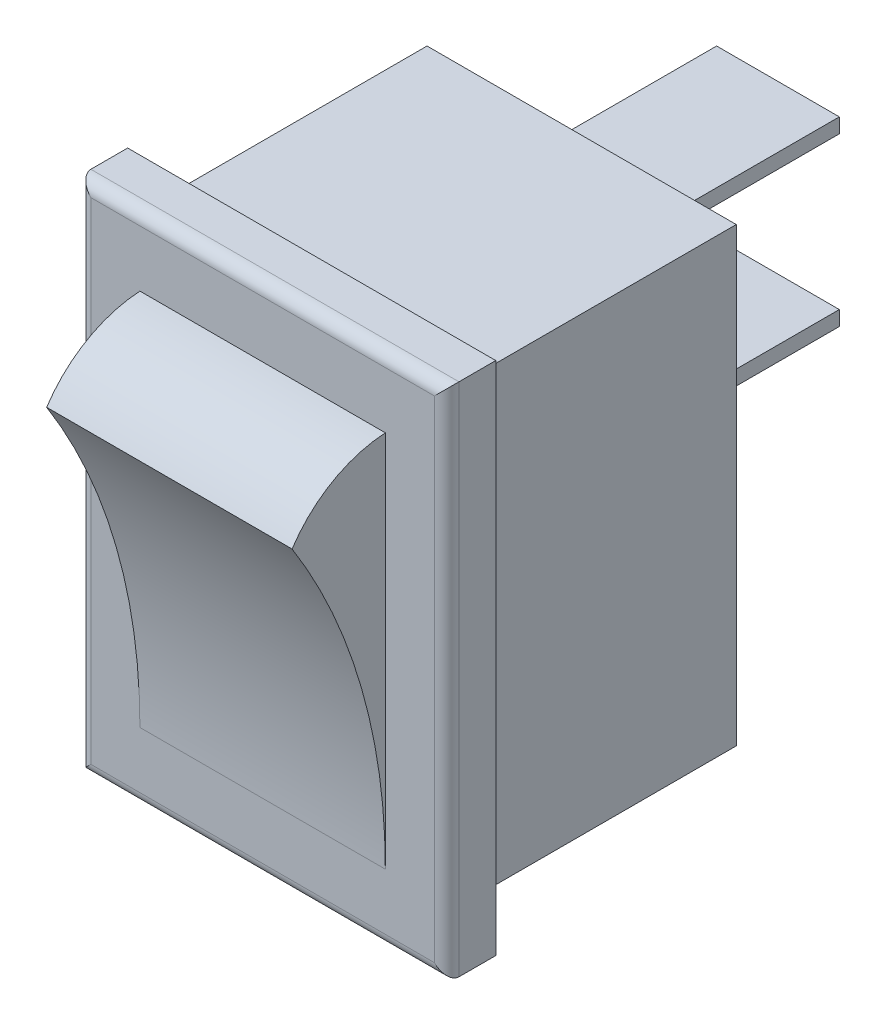
ISO-10303-21;
HEADER;
FILE_DESCRIPTION(('STEP AP214'),'2;1');
FILE_NAME('part.step','',(''),(''),'','','');
FILE_SCHEMA(('AUTOMOTIVE_DESIGN { 1 0 10303 214 1 1 1 1 }'));
ENDSEC;
DATA;
#1=APPLICATION_CONTEXT('core data for automotive mechanical design processes');
#2=APPLICATION_PROTOCOL_DEFINITION('international standard','automotive_design',2000,#1);
#3=PRODUCT_CONTEXT('',#1,'mechanical');
#4=PRODUCT('Part','Part','',(#3));
#5=PRODUCT_RELATED_PRODUCT_CATEGORY('part','',(#4));
#6=PRODUCT_DEFINITION_FORMATION('','',#4);
#7=PRODUCT_DEFINITION_CONTEXT('part definition',#1,'design');
#8=PRODUCT_DEFINITION('design','',#6,#7);
#9=PRODUCT_DEFINITION_SHAPE('','',#8);
#10=(LENGTH_UNIT() NAMED_UNIT(*) SI_UNIT(.MILLI.,.METRE.));
#11=(NAMED_UNIT(*) PLANE_ANGLE_UNIT() SI_UNIT($,.RADIAN.));
#12=(NAMED_UNIT(*) SI_UNIT($,.STERADIAN.) SOLID_ANGLE_UNIT());
#13=UNCERTAINTY_MEASURE_WITH_UNIT(LENGTH_MEASURE(1.E-05),#10,'distance_accuracy_value','');
#14=(GEOMETRIC_REPRESENTATION_CONTEXT(3) GLOBAL_UNCERTAINTY_ASSIGNED_CONTEXT((#13)) GLOBAL_UNIT_ASSIGNED_CONTEXT((#10,
#11,#12)) REPRESENTATION_CONTEXT('',''));
#15=CARTESIAN_POINT('',(0.,0.,0.));
#16=DIRECTION('',(0.,0.,1.));
#17=DIRECTION('',(1.,0.,0.));
#18=AXIS2_PLACEMENT_3D('',#15,#16,#17);
#19=CARTESIAN_POINT('',(0.,0.,0.));
#20=DIRECTION('',(0.,0.,-1.));
#21=DIRECTION('',(-1.,0.,0.));
#22=AXIS2_PLACEMENT_3D('',#19,#20,#21);
#23=PLANE('',#22);
#24=DIRECTION('',(0.,1.,0.));
#25=VECTOR('',#24,1.);
#26=CARTESIAN_POINT('',(6.3,-9.2,0.));
#27=LINE('',#26,#25);
#28=CARTESIAN_POINT('',(6.3,-9.2,0.));
#29=VERTEX_POINT('',#28);
#30=CARTESIAN_POINT('',(6.3,9.2,0.));
#31=VERTEX_POINT('',#30);
#32=EDGE_CURVE('E318',#29,#31,#27,.T.);
#33=ORIENTED_EDGE('',*,*,#32,.F.);
#34=DIRECTION('',(1.,0.,0.));
#35=VECTOR('',#34,1.);
#36=CARTESIAN_POINT('',(-6.3,-9.2,0.));
#37=LINE('',#36,#35);
#38=CARTESIAN_POINT('',(-6.3,-9.2,0.));
#39=VERTEX_POINT('',#38);
#40=EDGE_CURVE('E324',#39,#29,#37,.T.);
#41=ORIENTED_EDGE('',*,*,#40,.F.);
#42=DIRECTION('',(0.,-1.,0.));
#43=VECTOR('',#42,1.);
#44=CARTESIAN_POINT('',(-6.3,-9.2,0.));
#45=LINE('',#44,#43);
#46=CARTESIAN_POINT('',(-6.3,9.2,0.));
#47=VERTEX_POINT('',#46);
#48=EDGE_CURVE('E343',#47,#39,#45,.T.);
#49=ORIENTED_EDGE('',*,*,#48,.F.);
#50=DIRECTION('',(-1.,0.,0.));
#51=VECTOR('',#50,1.);
#52=CARTESIAN_POINT('',(-6.3,9.2,0.));
#53=LINE('',#52,#51);
#54=EDGE_CURVE('E340',#31,#47,#53,.T.);
#55=ORIENTED_EDGE('',*,*,#54,.F.);
#56=EDGE_LOOP('',(#33,#41,#49,#55));
#57=FACE_BOUND('',#56,.T.);
#58=DIRECTION('',(-1.,0.,0.));
#59=VECTOR('',#58,1.);
#60=CARTESIAN_POINT('',(-2.5,-0.3,0.));
#61=LINE('',#60,#59);
#62=CARTESIAN_POINT('',(2.5,-0.3,0.));
#63=VERTEX_POINT('',#62);
#64=CARTESIAN_POINT('',(-2.5,-0.3,0.));
#65=VERTEX_POINT('',#64);
#66=EDGE_CURVE('E218',#63,#65,#61,.T.);
#67=ORIENTED_EDGE('',*,*,#66,.F.);
#68=DIRECTION('',(0.,-1.,0.));
#69=VECTOR('',#68,1.);
#70=CARTESIAN_POINT('',(2.5,-0.3,0.));
#71=LINE('',#70,#69);
#72=CARTESIAN_POINT('',(2.5,0.3,0.));
#73=VERTEX_POINT('',#72);
#74=EDGE_CURVE('E213',#73,#63,#71,.T.);
#75=ORIENTED_EDGE('',*,*,#74,.F.);
#76=DIRECTION('',(1.,0.,0.));
#77=VECTOR('',#76,1.);
#78=CARTESIAN_POINT('',(-2.5,0.3,0.));
#79=LINE('',#78,#77);
#80=CARTESIAN_POINT('',(-2.5,0.3,0.));
#81=VERTEX_POINT('',#80);
#82=EDGE_CURVE('E228',#81,#73,#79,.T.);
#83=ORIENTED_EDGE('',*,*,#82,.F.);
#84=DIRECTION('',(0.,1.,0.));
#85=VECTOR('',#84,1.);
#86=CARTESIAN_POINT('',(-2.5,-0.3,0.));
#87=LINE('',#86,#85);
#88=EDGE_CURVE('E240',#65,#81,#87,.T.);
#89=ORIENTED_EDGE('',*,*,#88,.F.);
#90=EDGE_LOOP('',(#67,#75,#83,#89));
#91=FACE_BOUND('',#90,.T.);
#92=DIRECTION('',(-1.,0.,0.));
#93=VECTOR('',#92,1.);
#94=CARTESIAN_POINT('',(-2.5,6.5,0.));
#95=LINE('',#94,#93);
#96=CARTESIAN_POINT('',(2.5,6.5,0.));
#97=VERTEX_POINT('',#96);
#98=CARTESIAN_POINT('',(-2.5,6.5,0.));
#99=VERTEX_POINT('',#98);
#100=EDGE_CURVE('E671',#97,#99,#95,.T.);
#101=ORIENTED_EDGE('',*,*,#100,.F.);
#102=DIRECTION('',(0.,-1.,0.));
#103=VECTOR('',#102,1.);
#104=CARTESIAN_POINT('',(2.5,6.5,0.));
#105=LINE('',#104,#103);
#106=CARTESIAN_POINT('',(2.5,7.1,0.));
#107=VERTEX_POINT('',#106);
#108=EDGE_CURVE('E210',#107,#97,#105,.T.);
#109=ORIENTED_EDGE('',*,*,#108,.F.);
#110=DIRECTION('',(1.,0.,0.));
#111=VECTOR('',#110,1.);
#112=CARTESIAN_POINT('',(-2.5,7.1,0.));
#113=LINE('',#112,#111);
#114=CARTESIAN_POINT('',(-2.5,7.1,0.));
#115=VERTEX_POINT('',#114);
#116=EDGE_CURVE('E206',#115,#107,#113,.T.);
#117=ORIENTED_EDGE('',*,*,#116,.F.);
#118=DIRECTION('',(0.,1.,0.));
#119=VECTOR('',#118,1.);
#120=CARTESIAN_POINT('',(-2.5,6.5,0.));
#121=LINE('',#120,#119);
#122=EDGE_CURVE('E667',#99,#115,#121,.T.);
#123=ORIENTED_EDGE('',*,*,#122,.F.);
#124=EDGE_LOOP('',(#101,#109,#117,#123));
#125=FACE_BOUND('',#124,.T.);
#126=ADVANCED_FACE('F39',(#57,#91,#125),#23,.T.);
#127=CARTESIAN_POINT('',(6.3,-9.2,11.));
#128=DIRECTION('',(-1.,0.,0.));
#129=DIRECTION('',(0.,0.,1.));
#130=AXIS2_PLACEMENT_3D('',#127,#128,#129);
#131=PLANE('',#130);
#132=ORIENTED_EDGE('',*,*,#32,.T.);
#133=DIRECTION('',(0.,0.,-1.));
#134=VECTOR('',#133,1.);
#135=CARTESIAN_POINT('',(6.3,9.2,11.));
#136=LINE('',#135,#134);
#137=CARTESIAN_POINT('',(6.3,9.2,11.));
#138=VERTEX_POINT('',#137);
#139=EDGE_CURVE('E359',#138,#31,#136,.T.);
#140=ORIENTED_EDGE('',*,*,#139,.F.);
#141=DIRECTION('',(0.,1.,0.));
#142=VECTOR('',#141,1.);
#143=CARTESIAN_POINT('',(6.3,-9.2,11.));
#144=LINE('',#143,#142);
#145=CARTESIAN_POINT('',(6.3,-9.2,11.));
#146=VERTEX_POINT('',#145);
#147=EDGE_CURVE('E319',#146,#138,#144,.T.);
#148=ORIENTED_EDGE('',*,*,#147,.F.);
#149=DIRECTION('',(0.,0.,-1.));
#150=VECTOR('',#149,1.);
#151=CARTESIAN_POINT('',(6.3,-9.2,11.));
#152=LINE('',#151,#150);
#153=EDGE_CURVE('E336',#146,#29,#152,.T.);
#154=ORIENTED_EDGE('',*,*,#153,.T.);
#155=EDGE_LOOP('',(#132,#140,#148,#154));
#156=FACE_BOUND('',#155,.T.);
#157=ADVANCED_FACE('F445',(#156),#131,.F.);
#158=CARTESIAN_POINT('',(-6.3,9.2,11.));
#159=DIRECTION('',(0.,-1.,0.));
#160=DIRECTION('',(0.,0.,-1.));
#161=AXIS2_PLACEMENT_3D('',#158,#159,#160);
#162=PLANE('',#161);
#163=ORIENTED_EDGE('',*,*,#54,.T.);
#164=DIRECTION('',(0.,0.,-1.));
#165=VECTOR('',#164,1.);
#166=CARTESIAN_POINT('',(-6.3,9.2,11.));
#167=LINE('',#166,#165);
#168=CARTESIAN_POINT('',(-6.3,9.2,11.));
#169=VERTEX_POINT('',#168);
#170=EDGE_CURVE('E355',#169,#47,#167,.T.);
#171=ORIENTED_EDGE('',*,*,#170,.F.);
#172=DIRECTION('',(-1.,0.,0.));
#173=VECTOR('',#172,1.);
#174=CARTESIAN_POINT('',(-6.3,9.2,11.));
#175=LINE('',#174,#173);
#176=EDGE_CURVE('E323',#138,#169,#175,.T.);
#177=ORIENTED_EDGE('',*,*,#176,.F.);
#178=ORIENTED_EDGE('',*,*,#139,.T.);
#179=EDGE_LOOP('',(#163,#171,#177,#178));
#180=FACE_BOUND('',#179,.T.);
#181=ADVANCED_FACE('F451',(#180),#162,.F.);
#182=CARTESIAN_POINT('',(-6.3,-9.2,11.));
#183=DIRECTION('',(1.,0.,0.));
#184=DIRECTION('',(0.,0.,-1.));
#185=AXIS2_PLACEMENT_3D('',#182,#183,#184);
#186=PLANE('',#185);
#187=ORIENTED_EDGE('',*,*,#48,.T.);
#188=DIRECTION('',(0.,0.,-1.));
#189=VECTOR('',#188,1.);
#190=CARTESIAN_POINT('',(-6.3,-9.2,11.));
#191=LINE('',#190,#189);
#192=CARTESIAN_POINT('',(-6.3,-9.2,11.));
#193=VERTEX_POINT('',#192);
#194=EDGE_CURVE('E351',#193,#39,#191,.T.);
#195=ORIENTED_EDGE('',*,*,#194,.F.);
#196=DIRECTION('',(0.,-1.,0.));
#197=VECTOR('',#196,1.);
#198=CARTESIAN_POINT('',(-6.3,-9.2,11.));
#199=LINE('',#198,#197);
#200=EDGE_CURVE('E328',#169,#193,#199,.T.);
#201=ORIENTED_EDGE('',*,*,#200,.F.);
#202=ORIENTED_EDGE('',*,*,#170,.T.);
#203=EDGE_LOOP('',(#187,#195,#201,#202));
#204=FACE_BOUND('',#203,.T.);
#205=ADVANCED_FACE('F462',(#204),#186,.F.);
#206=CARTESIAN_POINT('',(-6.3,-9.2,11.));
#207=DIRECTION('',(0.,1.,0.));
#208=DIRECTION('',(0.,0.,1.));
#209=AXIS2_PLACEMENT_3D('',#206,#207,#208);
#210=PLANE('',#209);
#211=ORIENTED_EDGE('',*,*,#40,.T.);
#212=ORIENTED_EDGE('',*,*,#153,.F.);
#213=DIRECTION('',(1.,0.,0.));
#214=VECTOR('',#213,1.);
#215=CARTESIAN_POINT('',(-6.3,-9.2,11.));
#216=LINE('',#215,#214);
#217=EDGE_CURVE('E332',#193,#146,#216,.T.);
#218=ORIENTED_EDGE('',*,*,#217,.F.);
#219=ORIENTED_EDGE('',*,*,#194,.T.);
#220=EDGE_LOOP('',(#211,#212,#218,#219));
#221=FACE_BOUND('',#220,.T.);
#222=ADVANCED_FACE('F459',(#221),#210,.F.);
#223=CARTESIAN_POINT('',(7.5,-10.5,13.));
#224=DIRECTION('',(-1.,0.,0.));
#225=DIRECTION('',(0.,0.,1.));
#226=AXIS2_PLACEMENT_3D('',#223,#224,#225);
#227=PLANE('',#226);
#228=DIRECTION('',(0.,0.,-1.));
#229=VECTOR('',#228,1.);
#230=CARTESIAN_POINT('',(7.5,10.5,13.));
#231=LINE('',#230,#229);
#232=CARTESIAN_POINT('',(7.5,10.5,12.5));
#233=VERTEX_POINT('',#232);
#234=CARTESIAN_POINT('',(7.5,10.5,11.));
#235=VERTEX_POINT('',#234);
#236=EDGE_CURVE('E315',#233,#235,#231,.T.);
#237=ORIENTED_EDGE('',*,*,#236,.F.);
#238=DIRECTION('',(0.,1.,0.));
#239=VECTOR('',#238,1.);
#240=CARTESIAN_POINT('',(7.5,-10.5,12.5));
#241=LINE('',#240,#239);
#242=CARTESIAN_POINT('',(7.5,-10.5,12.5));
#243=VERTEX_POINT('',#242);
#244=EDGE_CURVE('E11',#233,#243,#241,.F.);
#245=ORIENTED_EDGE('',*,*,#244,.T.);
#246=DIRECTION('',(0.,0.,-1.));
#247=VECTOR('',#246,1.);
#248=CARTESIAN_POINT('',(7.5,-10.5,13.));
#249=LINE('',#248,#247);
#250=CARTESIAN_POINT('',(7.5,-10.5,11.));
#251=VERTEX_POINT('',#250);
#252=EDGE_CURVE('E306',#243,#251,#249,.T.);
#253=ORIENTED_EDGE('',*,*,#252,.T.);
#254=DIRECTION('',(0.,1.,0.));
#255=VECTOR('',#254,1.);
#256=CARTESIAN_POINT('',(7.5,-10.5,11.));
#257=LINE('',#256,#255);
#258=EDGE_CURVE('E290',#251,#235,#257,.T.);
#259=ORIENTED_EDGE('',*,*,#258,.T.);
#260=EDGE_LOOP('',(#237,#245,#253,#259));
#261=FACE_BOUND('',#260,.T.);
#262=ADVANCED_FACE('F413',(#261),#227,.F.);
#263=CARTESIAN_POINT('',(-7.5,10.5,13.));
#264=DIRECTION('',(0.,-1.,0.));
#265=DIRECTION('',(0.,0.,-1.));
#266=AXIS2_PLACEMENT_3D('',#263,#264,#265);
#267=PLANE('',#266);
#268=DIRECTION('',(0.,0.,-1.));
#269=VECTOR('',#268,1.);
#270=CARTESIAN_POINT('',(-7.5,10.5,13.));
#271=LINE('',#270,#269);
#272=CARTESIAN_POINT('',(-7.5,10.5,12.5));
#273=VERTEX_POINT('',#272);
#274=CARTESIAN_POINT('',(-7.5,10.5,11.));
#275=VERTEX_POINT('',#274);
#276=EDGE_CURVE('E312',#273,#275,#271,.T.);
#277=ORIENTED_EDGE('',*,*,#276,.F.);
#278=DIRECTION('',(-1.,0.,0.));
#279=VECTOR('',#278,1.);
#280=CARTESIAN_POINT('',(-7.5,10.5,12.5));
#281=LINE('',#280,#279);
#282=EDGE_CURVE('E49',#273,#233,#281,.F.);
#283=ORIENTED_EDGE('',*,*,#282,.T.);
#284=ORIENTED_EDGE('',*,*,#236,.T.);
#285=DIRECTION('',(-1.,0.,0.));
#286=VECTOR('',#285,1.);
#287=CARTESIAN_POINT('',(-7.5,10.5,11.));
#288=LINE('',#287,#286);
#289=EDGE_CURVE('E294',#235,#275,#288,.T.);
#290=ORIENTED_EDGE('',*,*,#289,.T.);
#291=EDGE_LOOP('',(#277,#283,#284,#290));
#292=FACE_BOUND('',#291,.T.);
#293=ADVANCED_FACE('F410',(#292),#267,.F.);
#294=CARTESIAN_POINT('',(-7.5,-10.5,13.));
#295=DIRECTION('',(1.,0.,0.));
#296=DIRECTION('',(0.,0.,-1.));
#297=AXIS2_PLACEMENT_3D('',#294,#295,#296);
#298=PLANE('',#297);
#299=DIRECTION('',(0.,0.,-1.));
#300=VECTOR('',#299,1.);
#301=CARTESIAN_POINT('',(-7.5,-10.5,13.));
#302=LINE('',#301,#300);
#303=CARTESIAN_POINT('',(-7.5,-10.5,12.5));
#304=VERTEX_POINT('',#303);
#305=CARTESIAN_POINT('',(-7.5,-10.5,11.));
#306=VERTEX_POINT('',#305);
#307=EDGE_CURVE('E309',#304,#306,#302,.T.);
#308=ORIENTED_EDGE('',*,*,#307,.F.);
#309=DIRECTION('',(0.,-1.,0.));
#310=VECTOR('',#309,1.);
#311=CARTESIAN_POINT('',(-7.5,-10.5,12.5));
#312=LINE('',#311,#310);
#313=EDGE_CURVE('E380',#304,#273,#312,.F.);
#314=ORIENTED_EDGE('',*,*,#313,.T.);
#315=ORIENTED_EDGE('',*,*,#276,.T.);
#316=DIRECTION('',(0.,-1.,0.));
#317=VECTOR('',#316,1.);
#318=CARTESIAN_POINT('',(-7.5,-10.5,11.));
#319=LINE('',#318,#317);
#320=EDGE_CURVE('E298',#275,#306,#319,.T.);
#321=ORIENTED_EDGE('',*,*,#320,.T.);
#322=EDGE_LOOP('',(#308,#314,#315,#321));
#323=FACE_BOUND('',#322,.T.);
#324=ADVANCED_FACE('F422',(#323),#298,.F.);
#325=CARTESIAN_POINT('',(-7.5,-10.5,13.));
#326=DIRECTION('',(0.,1.,0.));
#327=DIRECTION('',(0.,0.,1.));
#328=AXIS2_PLACEMENT_3D('',#325,#326,#327);
#329=PLANE('',#328);
#330=ORIENTED_EDGE('',*,*,#252,.F.);
#331=DIRECTION('',(1.,0.,0.));
#332=VECTOR('',#331,1.);
#333=CARTESIAN_POINT('',(-7.5,-10.5,12.5));
#334=LINE('',#333,#332);
#335=EDGE_CURVE('E376',#243,#304,#334,.F.);
#336=ORIENTED_EDGE('',*,*,#335,.T.);
#337=ORIENTED_EDGE('',*,*,#307,.T.);
#338=DIRECTION('',(1.,0.,0.));
#339=VECTOR('',#338,1.);
#340=CARTESIAN_POINT('',(-7.5,-10.5,11.));
#341=LINE('',#340,#339);
#342=EDGE_CURVE('E302',#306,#251,#341,.T.);
#343=ORIENTED_EDGE('',*,*,#342,.T.);
#344=EDGE_LOOP('',(#330,#336,#337,#343));
#345=FACE_BOUND('',#344,.T.);
#346=ADVANCED_FACE('F424',(#345),#329,.F.);
#347=CARTESIAN_POINT('',(0.,0.,13.));
#348=DIRECTION('',(0.,0.,-1.));
#349=DIRECTION('',(-1.,0.,0.));
#350=AXIS2_PLACEMENT_3D('',#347,#348,#349);
#351=PLANE('',#350);
#352=DIRECTION('',(-1.,0.,0.));
#353=VECTOR('',#352,1.);
#354=CARTESIAN_POINT('',(5.,7.7,13.));
#355=LINE('',#354,#353);
#356=CARTESIAN_POINT('',(5.,7.7,13.));
#357=VERTEX_POINT('',#356);
#358=CARTESIAN_POINT('',(-5.,7.7,13.));
#359=VERTEX_POINT('',#358);
#360=EDGE_CURVE('E282',#357,#359,#355,.T.);
#361=ORIENTED_EDGE('',*,*,#360,.F.);
#362=DIRECTION('',(0.,1.,0.));
#363=VECTOR('',#362,1.);
#364=CARTESIAN_POINT('',(5.,-7.7,13.));
#365=LINE('',#364,#363);
#366=CARTESIAN_POINT('',(5.,-7.7,13.));
#367=VERTEX_POINT('',#366);
#368=EDGE_CURVE('E262',#367,#357,#365,.T.);
#369=ORIENTED_EDGE('',*,*,#368,.F.);
#370=DIRECTION('',(-1.,0.,0.));
#371=VECTOR('',#370,1.);
#372=CARTESIAN_POINT('',(5.,-7.7,13.));
#373=LINE('',#372,#371);
#374=CARTESIAN_POINT('',(-5.,-7.7,13.));
#375=VERTEX_POINT('',#374);
#376=EDGE_CURVE('E286',#367,#375,#373,.T.);
#377=ORIENTED_EDGE('',*,*,#376,.T.);
#378=DIRECTION('',(0.,1.,0.));
#379=VECTOR('',#378,1.);
#380=CARTESIAN_POINT('',(-5.,-7.7,13.));
#381=LINE('',#380,#379);
#382=EDGE_CURVE('E274',#375,#359,#381,.T.);
#383=ORIENTED_EDGE('',*,*,#382,.T.);
#384=EDGE_LOOP('',(#361,#369,#377,#383));
#385=FACE_BOUND('',#384,.T.);
#386=DIRECTION('',(0.,-1.,0.));
#387=VECTOR('',#386,1.);
#388=CARTESIAN_POINT('',(-7.,0.,13.));
#389=LINE('',#388,#387);
#390=CARTESIAN_POINT('',(-7.,10.,13.));
#391=VERTEX_POINT('',#390);
#392=CARTESIAN_POINT('',(-7.,-10.,13.));
#393=VERTEX_POINT('',#392);
#394=EDGE_CURVE('E369',#391,#393,#389,.T.);
#395=ORIENTED_EDGE('',*,*,#394,.T.);
#396=DIRECTION('',(1.,0.,0.));
#397=VECTOR('',#396,1.);
#398=CARTESIAN_POINT('',(0.,-10.,13.));
#399=LINE('',#398,#397);
#400=CARTESIAN_POINT('',(7.,-10.,13.));
#401=VERTEX_POINT('',#400);
#402=EDGE_CURVE('E372',#393,#401,#399,.T.);
#403=ORIENTED_EDGE('',*,*,#402,.T.);
#404=DIRECTION('',(0.,1.,0.));
#405=VECTOR('',#404,1.);
#406=CARTESIAN_POINT('',(7.,0.,13.));
#407=LINE('',#406,#405);
#408=CARTESIAN_POINT('',(7.,10.,13.));
#409=VERTEX_POINT('',#408);
#410=EDGE_CURVE('E363',#401,#409,#407,.T.);
#411=ORIENTED_EDGE('',*,*,#410,.T.);
#412=DIRECTION('',(-1.,0.,0.));
#413=VECTOR('',#412,1.);
#414=CARTESIAN_POINT('',(0.,10.,13.));
#415=LINE('',#414,#413);
#416=EDGE_CURVE('E366',#409,#391,#415,.T.);
#417=ORIENTED_EDGE('',*,*,#416,.T.);
#418=EDGE_LOOP('',(#395,#403,#411,#417));
#419=FACE_BOUND('',#418,.T.);
#420=ADVANCED_FACE('F432',(#385,#419),#351,.F.);
#421=CARTESIAN_POINT('',(0.,0.,11.));
#422=DIRECTION('',(0.,0.,-1.));
#423=DIRECTION('',(-1.,0.,0.));
#424=AXIS2_PLACEMENT_3D('',#421,#422,#423);
#425=PLANE('',#424);
#426=ORIENTED_EDGE('',*,*,#217,.T.);
#427=ORIENTED_EDGE('',*,*,#147,.T.);
#428=ORIENTED_EDGE('',*,*,#176,.T.);
#429=ORIENTED_EDGE('',*,*,#200,.T.);
#430=EDGE_LOOP('',(#426,#427,#428,#429));
#431=FACE_BOUND('',#430,.T.);
#432=ORIENTED_EDGE('',*,*,#258,.F.);
#433=ORIENTED_EDGE('',*,*,#342,.F.);
#434=ORIENTED_EDGE('',*,*,#320,.F.);
#435=ORIENTED_EDGE('',*,*,#289,.F.);
#436=EDGE_LOOP('',(#432,#433,#434,#435));
#437=FACE_BOUND('',#436,.T.);
#438=ADVANCED_FACE('F418',(#431,#437),#425,.T.);
#439=CARTESIAN_POINT('',(0.,10.,12.5));
#440=DIRECTION('',(-1.,0.,0.));
#441=DIRECTION('',(0.,0.,1.));
#442=AXIS2_PLACEMENT_3D('',#439,#440,#441);
#443=CYLINDRICAL_SURFACE('',#442,0.5);
#444=CARTESIAN_POINT('',(7.,10.,12.5));
#445=DIRECTION('',(-0.707106781186547,0.707106781186547,0.));
#446=DIRECTION('',(0.707106781186547,0.707106781186547,0.));
#447=AXIS2_PLACEMENT_3D('',#444,#445,#446);
#448=ELLIPSE('',#447,0.707106781186547,0.5);
#449=EDGE_CURVE('E389',#233,#409,#448,.F.);
#450=ORIENTED_EDGE('',*,*,#449,.F.);
#451=ORIENTED_EDGE('',*,*,#282,.F.);
#452=CARTESIAN_POINT('',(-7.,10.,12.5));
#453=DIRECTION('',(-0.707106781186547,-0.707106781186547,0.));
#454=DIRECTION('',(-0.707106781186547,0.707106781186547,0.));
#455=AXIS2_PLACEMENT_3D('',#452,#453,#454);
#456=ELLIPSE('',#455,0.707106781186547,0.5);
#457=EDGE_CURVE('E43',#391,#273,#456,.T.);
#458=ORIENTED_EDGE('',*,*,#457,.F.);
#459=ORIENTED_EDGE('',*,*,#416,.F.);
#460=EDGE_LOOP('',(#450,#451,#458,#459));
#461=FACE_BOUND('',#460,.T.);
#462=ADVANCED_FACE('F41',(#461),#443,.T.);
#463=CARTESIAN_POINT('',(-7.,0.,12.5));
#464=DIRECTION('',(0.,-1.,0.));
#465=DIRECTION('',(0.,0.,-1.));
#466=AXIS2_PLACEMENT_3D('',#463,#464,#465);
#467=CYLINDRICAL_SURFACE('',#466,0.5);
#468=ORIENTED_EDGE('',*,*,#457,.T.);
#469=ORIENTED_EDGE('',*,*,#313,.F.);
#470=CARTESIAN_POINT('',(-7.,-10.,12.5));
#471=DIRECTION('',(0.707106781186547,-0.707106781186547,0.));
#472=DIRECTION('',(-0.707106781186547,-0.707106781186547,0.));
#473=AXIS2_PLACEMENT_3D('',#470,#471,#472);
#474=ELLIPSE('',#473,0.707106781186547,0.5);
#475=EDGE_CURVE('E387',#393,#304,#474,.T.);
#476=ORIENTED_EDGE('',*,*,#475,.F.);
#477=ORIENTED_EDGE('',*,*,#394,.F.);
#478=EDGE_LOOP('',(#468,#469,#476,#477));
#479=FACE_BOUND('',#478,.T.);
#480=ADVANCED_FACE('F402',(#479),#467,.T.);
#481=CARTESIAN_POINT('',(7.,0.,12.5));
#482=DIRECTION('',(0.,1.,0.));
#483=DIRECTION('',(0.,0.,1.));
#484=AXIS2_PLACEMENT_3D('',#481,#482,#483);
#485=CYLINDRICAL_SURFACE('',#484,0.5);
#486=ORIENTED_EDGE('',*,*,#449,.T.);
#487=ORIENTED_EDGE('',*,*,#410,.F.);
#488=CARTESIAN_POINT('',(7.,-10.,12.5));
#489=DIRECTION('',(0.707106781186547,0.707106781186547,0.));
#490=DIRECTION('',(-0.707106781186547,0.707106781186547,0.));
#491=AXIS2_PLACEMENT_3D('',#488,#489,#490);
#492=ELLIPSE('',#491,0.707106781186547,0.5);
#493=EDGE_CURVE('E289',#243,#401,#492,.F.);
#494=ORIENTED_EDGE('',*,*,#493,.F.);
#495=ORIENTED_EDGE('',*,*,#244,.F.);
#496=EDGE_LOOP('',(#486,#487,#494,#495));
#497=FACE_BOUND('',#496,.T.);
#498=ADVANCED_FACE('F430',(#497),#485,.T.);
#499=CARTESIAN_POINT('',(0.,-10.,12.5));
#500=DIRECTION('',(1.,0.,0.));
#501=DIRECTION('',(0.,0.,-1.));
#502=AXIS2_PLACEMENT_3D('',#499,#500,#501);
#503=CYLINDRICAL_SURFACE('',#502,0.5);
#504=ORIENTED_EDGE('',*,*,#475,.T.);
#505=ORIENTED_EDGE('',*,*,#335,.F.);
#506=ORIENTED_EDGE('',*,*,#493,.T.);
#507=ORIENTED_EDGE('',*,*,#402,.F.);
#508=EDGE_LOOP('',(#504,#505,#506,#507));
#509=FACE_BOUND('',#508,.T.);
#510=ADVANCED_FACE('F428',(#509),#503,.T.);
#511=CARTESIAN_POINT('',(5.,-7.7,37.8263157894737));
#512=DIRECTION('',(-1.,0.,0.));
#513=DIRECTION('',(0.,0.,1.));
#514=AXIS2_PLACEMENT_3D('',#511,#512,#513);
#515=CYLINDRICAL_SURFACE('',#514,24.8263157894737);
#516=CARTESIAN_POINT('',(-5.,-7.7,37.8263157894737));
#517=DIRECTION('',(-1.,0.,0.));
#518=DIRECTION('',(0.,0.,-1.));
#519=AXIS2_PLACEMENT_3D('',#516,#517,#518);
#520=CIRCLE('',#519,24.8263157894737);
#521=CARTESIAN_POINT('',(-5.,5.5,16.8));
#522=VERTEX_POINT('',#521);
#523=EDGE_CURVE('E257',#522,#375,#520,.T.);
#524=ORIENTED_EDGE('',*,*,#523,.T.);
#525=ORIENTED_EDGE('',*,*,#376,.F.);
#526=CARTESIAN_POINT('',(5.,-7.7,37.8263157894737));
#527=DIRECTION('',(-1.,0.,0.));
#528=DIRECTION('',(0.,0.,-1.));
#529=AXIS2_PLACEMENT_3D('',#526,#527,#528);
#530=CIRCLE('',#529,24.8263157894737);
#531=CARTESIAN_POINT('',(5.,5.5,16.8));
#532=VERTEX_POINT('',#531);
#533=EDGE_CURVE('E258',#532,#367,#530,.T.);
#534=ORIENTED_EDGE('',*,*,#533,.F.);
#535=DIRECTION('',(-1.,0.,0.));
#536=VECTOR('',#535,1.);
#537=CARTESIAN_POINT('',(5.,5.5,16.8));
#538=LINE('',#537,#536);
#539=EDGE_CURVE('E270',#532,#522,#538,.T.);
#540=ORIENTED_EDGE('',*,*,#539,.T.);
#541=EDGE_LOOP('',(#524,#525,#534,#540));
#542=FACE_BOUND('',#541,.T.);
#543=ADVANCED_FACE('F472',(#542),#515,.F.);
#544=CARTESIAN_POINT('',(5.,2.81849872444753,12.710709787838));
#545=DIRECTION('',(-1.,0.,0.));
#546=DIRECTION('',(0.,0.,1.));
#547=AXIS2_PLACEMENT_3D('',#544,#545,#546);
#548=CYLINDRICAL_SURFACE('',#547,4.89006580017826);
#549=CARTESIAN_POINT('',(-5.,2.81849872444753,12.710709787838));
#550=DIRECTION('',(1.,0.,0.));
#551=DIRECTION('',(0.,0.,1.));
#552=AXIS2_PLACEMENT_3D('',#549,#550,#551);
#553=CIRCLE('',#552,4.89006580017826);
#554=EDGE_CURVE('E263',#359,#522,#553,.T.);
#555=ORIENTED_EDGE('',*,*,#554,.T.);
#556=ORIENTED_EDGE('',*,*,#539,.F.);
#557=CARTESIAN_POINT('',(5.,2.81849872444753,12.710709787838));
#558=DIRECTION('',(1.,0.,0.));
#559=DIRECTION('',(0.,0.,1.));
#560=AXIS2_PLACEMENT_3D('',#557,#558,#559);
#561=CIRCLE('',#560,4.89006580017826);
#562=EDGE_CURVE('E267',#357,#532,#561,.T.);
#563=ORIENTED_EDGE('',*,*,#562,.F.);
#564=ORIENTED_EDGE('',*,*,#360,.T.);
#565=EDGE_LOOP('',(#555,#556,#563,#564));
#566=FACE_BOUND('',#565,.T.);
#567=ADVANCED_FACE('F533',(#566),#548,.T.);
#568=CARTESIAN_POINT('',(5.,-7.7,37.8263157894737));
#569=DIRECTION('',(1.,0.,0.));
#570=DIRECTION('',(0.,0.,-1.));
#571=AXIS2_PLACEMENT_3D('',#568,#569,#570);
#572=PLANE('',#571);
#573=ORIENTED_EDGE('',*,*,#533,.T.);
#574=ORIENTED_EDGE('',*,*,#368,.T.);
#575=ORIENTED_EDGE('',*,*,#562,.T.);
#576=EDGE_LOOP('',(#573,#574,#575));
#577=FACE_BOUND('',#576,.T.);
#578=ADVANCED_FACE('F542',(#577),#572,.T.);
#579=CARTESIAN_POINT('',(-5.,-7.7,37.8263157894737));
#580=DIRECTION('',(1.,0.,0.));
#581=DIRECTION('',(0.,0.,-1.));
#582=AXIS2_PLACEMENT_3D('',#579,#580,#581);
#583=PLANE('',#582);
#584=ORIENTED_EDGE('',*,*,#523,.F.);
#585=ORIENTED_EDGE('',*,*,#554,.F.);
#586=ORIENTED_EDGE('',*,*,#382,.F.);
#587=EDGE_LOOP('',(#584,#585,#586));
#588=FACE_BOUND('',#587,.T.);
#589=ADVANCED_FACE('F552',(#588),#583,.F.);
#590=CARTESIAN_POINT('',(2.5,-0.3,-8.));
#591=DIRECTION('',(-1.,0.,0.));
#592=DIRECTION('',(0.,0.,1.));
#593=AXIS2_PLACEMENT_3D('',#590,#591,#592);
#594=PLANE('',#593);
#595=ORIENTED_EDGE('',*,*,#74,.T.);
#596=DIRECTION('',(0.,0.,1.));
#597=VECTOR('',#596,1.);
#598=CARTESIAN_POINT('',(2.5,-0.3,-8.));
#599=LINE('',#598,#597);
#600=CARTESIAN_POINT('',(2.5,-0.3,-8.));
#601=VERTEX_POINT('',#600);
#602=EDGE_CURVE('E254',#601,#63,#599,.T.);
#603=ORIENTED_EDGE('',*,*,#602,.F.);
#604=DIRECTION('',(0.,-1.,0.));
#605=VECTOR('',#604,1.);
#606=CARTESIAN_POINT('',(2.5,-0.3,-8.));
#607=LINE('',#606,#605);
#608=CARTESIAN_POINT('',(2.5,0.3,-8.));
#609=VERTEX_POINT('',#608);
#610=EDGE_CURVE('E223',#609,#601,#607,.T.);
#611=ORIENTED_EDGE('',*,*,#610,.F.);
#612=DIRECTION('',(0.,0.,1.));
#613=VECTOR('',#612,1.);
#614=CARTESIAN_POINT('',(2.5,0.3,-8.));
#615=LINE('',#614,#613);
#616=EDGE_CURVE('E236',#609,#73,#615,.T.);
#617=ORIENTED_EDGE('',*,*,#616,.T.);
#618=EDGE_LOOP('',(#595,#603,#611,#617));
#619=FACE_BOUND('',#618,.T.);
#620=ADVANCED_FACE('F562',(#619),#594,.F.);
#621=CARTESIAN_POINT('',(-2.5,-0.3,-8.));
#622=DIRECTION('',(0.,1.,0.));
#623=DIRECTION('',(-1.,0.,0.));
#624=AXIS2_PLACEMENT_3D('',#621,#622,#623);
#625=PLANE('',#624);
#626=ORIENTED_EDGE('',*,*,#66,.T.);
#627=DIRECTION('',(0.,0.,1.));
#628=VECTOR('',#627,1.);
#629=CARTESIAN_POINT('',(-2.5,-0.3,-8.));
#630=LINE('',#629,#628);
#631=CARTESIAN_POINT('',(-2.5,-0.3,-8.));
#632=VERTEX_POINT('',#631);
#633=EDGE_CURVE('E250',#632,#65,#630,.T.);
#634=ORIENTED_EDGE('',*,*,#633,.F.);
#635=DIRECTION('',(-1.,0.,0.));
#636=VECTOR('',#635,1.);
#637=CARTESIAN_POINT('',(-2.5,-0.3,-8.));
#638=LINE('',#637,#636);
#639=EDGE_CURVE('E227',#601,#632,#638,.T.);
#640=ORIENTED_EDGE('',*,*,#639,.F.);
#641=ORIENTED_EDGE('',*,*,#602,.T.);
#642=EDGE_LOOP('',(#626,#634,#640,#641));
#643=FACE_BOUND('',#642,.T.);
#644=ADVANCED_FACE('F572',(#643),#625,.F.);
#645=CARTESIAN_POINT('',(-2.5,-0.3,-8.));
#646=DIRECTION('',(1.,0.,0.));
#647=DIRECTION('',(0.,0.,-1.));
#648=AXIS2_PLACEMENT_3D('',#645,#646,#647);
#649=PLANE('',#648);
#650=ORIENTED_EDGE('',*,*,#88,.T.);
#651=DIRECTION('',(0.,0.,1.));
#652=VECTOR('',#651,1.);
#653=CARTESIAN_POINT('',(-2.5,0.3,-8.));
#654=LINE('',#653,#652);
#655=CARTESIAN_POINT('',(-2.5,0.3,-8.));
#656=VERTEX_POINT('',#655);
#657=EDGE_CURVE('E65',#656,#81,#654,.T.);
#658=ORIENTED_EDGE('',*,*,#657,.F.);
#659=DIRECTION('',(0.,1.,0.));
#660=VECTOR('',#659,1.);
#661=CARTESIAN_POINT('',(-2.5,-0.3,-8.));
#662=LINE('',#661,#660);
#663=EDGE_CURVE('E231',#632,#656,#662,.T.);
#664=ORIENTED_EDGE('',*,*,#663,.F.);
#665=ORIENTED_EDGE('',*,*,#633,.T.);
#666=EDGE_LOOP('',(#650,#658,#664,#665));
#667=FACE_BOUND('',#666,.T.);
#668=ADVANCED_FACE('F582',(#667),#649,.F.);
#669=CARTESIAN_POINT('',(-2.5,0.3,-8.));
#670=DIRECTION('',(0.,-1.,0.));
#671=DIRECTION('',(1.,0.,0.));
#672=AXIS2_PLACEMENT_3D('',#669,#670,#671);
#673=PLANE('',#672);
#674=ORIENTED_EDGE('',*,*,#82,.T.);
#675=ORIENTED_EDGE('',*,*,#616,.F.);
#676=DIRECTION('',(1.,0.,0.));
#677=VECTOR('',#676,1.);
#678=CARTESIAN_POINT('',(-2.5,0.3,-8.));
#679=LINE('',#678,#677);
#680=EDGE_CURVE('E234',#656,#609,#679,.T.);
#681=ORIENTED_EDGE('',*,*,#680,.F.);
#682=ORIENTED_EDGE('',*,*,#657,.T.);
#683=EDGE_LOOP('',(#674,#675,#681,#682));
#684=FACE_BOUND('',#683,.T.);
#685=ADVANCED_FACE('F592',(#684),#673,.F.);
#686=CARTESIAN_POINT('',(0.,0.,-8.));
#687=DIRECTION('',(0.,0.,-1.));
#688=DIRECTION('',(-1.,0.,0.));
#689=AXIS2_PLACEMENT_3D('',#686,#687,#688);
#690=PLANE('',#689);
#691=ORIENTED_EDGE('',*,*,#610,.T.);
#692=ORIENTED_EDGE('',*,*,#639,.T.);
#693=ORIENTED_EDGE('',*,*,#663,.T.);
#694=ORIENTED_EDGE('',*,*,#680,.T.);
#695=EDGE_LOOP('',(#691,#692,#693,#694));
#696=FACE_BOUND('',#695,.T.);
#697=ADVANCED_FACE('F602',(#696),#690,.T.);
#698=CARTESIAN_POINT('',(2.5,6.5,-8.));
#699=DIRECTION('',(-1.,0.,0.));
#700=DIRECTION('',(0.,0.,1.));
#701=AXIS2_PLACEMENT_3D('',#698,#699,#700);
#702=PLANE('',#701);
#703=ORIENTED_EDGE('',*,*,#108,.T.);
#704=DIRECTION('',(0.,0.,1.));
#705=VECTOR('',#704,1.);
#706=CARTESIAN_POINT('',(2.5,6.5,-8.));
#707=LINE('',#706,#705);
#708=CARTESIAN_POINT('',(2.5,6.5,-8.));
#709=VERTEX_POINT('',#708);
#710=EDGE_CURVE('E189',#709,#97,#707,.T.);
#711=ORIENTED_EDGE('',*,*,#710,.F.);
#712=DIRECTION('',(0.,-1.,0.));
#713=VECTOR('',#712,1.);
#714=CARTESIAN_POINT('',(2.5,6.5,-8.));
#715=LINE('',#714,#713);
#716=CARTESIAN_POINT('',(2.5,7.1,-8.));
#717=VERTEX_POINT('',#716);
#718=EDGE_CURVE('E197',#717,#709,#715,.T.);
#719=ORIENTED_EDGE('',*,*,#718,.F.);
#720=DIRECTION('',(0.,0.,1.));
#721=VECTOR('',#720,1.);
#722=CARTESIAN_POINT('',(2.5,7.1,-8.));
#723=LINE('',#722,#721);
#724=EDGE_CURVE('E663',#717,#107,#723,.T.);
#725=ORIENTED_EDGE('',*,*,#724,.T.);
#726=EDGE_LOOP('',(#703,#711,#719,#725));
#727=FACE_BOUND('',#726,.T.);
#728=ADVANCED_FACE('F208',(#727),#702,.F.);
#729=CARTESIAN_POINT('',(-2.5,6.5,-8.));
#730=DIRECTION('',(0.,1.,0.));
#731=DIRECTION('',(-1.,0.,0.));
#732=AXIS2_PLACEMENT_3D('',#729,#730,#731);
#733=PLANE('',#732);
#734=ORIENTED_EDGE('',*,*,#100,.T.);
#735=DIRECTION('',(0.,0.,1.));
#736=VECTOR('',#735,1.);
#737=CARTESIAN_POINT('',(-2.5,6.5,-8.));
#738=LINE('',#737,#736);
#739=CARTESIAN_POINT('',(-2.5,6.5,-8.));
#740=VERTEX_POINT('',#739);
#741=EDGE_CURVE('E192',#740,#99,#738,.T.);
#742=ORIENTED_EDGE('',*,*,#741,.F.);
#743=DIRECTION('',(-1.,0.,0.));
#744=VECTOR('',#743,1.);
#745=CARTESIAN_POINT('',(-2.5,6.5,-8.));
#746=LINE('',#745,#744);
#747=EDGE_CURVE('E185',#709,#740,#746,.T.);
#748=ORIENTED_EDGE('',*,*,#747,.F.);
#749=ORIENTED_EDGE('',*,*,#710,.T.);
#750=EDGE_LOOP('',(#734,#742,#748,#749));
#751=FACE_BOUND('',#750,.T.);
#752=ADVANCED_FACE('F187',(#751),#733,.F.);
#753=CARTESIAN_POINT('',(-2.5,6.5,-8.));
#754=DIRECTION('',(1.,0.,0.));
#755=DIRECTION('',(0.,0.,-1.));
#756=AXIS2_PLACEMENT_3D('',#753,#754,#755);
#757=PLANE('',#756);
#758=ORIENTED_EDGE('',*,*,#122,.T.);
#759=DIRECTION('',(0.,0.,1.));
#760=VECTOR('',#759,1.);
#761=CARTESIAN_POINT('',(-2.5,7.1,-8.));
#762=LINE('',#761,#760);
#763=CARTESIAN_POINT('',(-2.5,7.1,-8.));
#764=VERTEX_POINT('',#763);
#765=EDGE_CURVE('E57',#764,#115,#762,.T.);
#766=ORIENTED_EDGE('',*,*,#765,.F.);
#767=DIRECTION('',(0.,1.,0.));
#768=VECTOR('',#767,1.);
#769=CARTESIAN_POINT('',(-2.5,6.5,-8.));
#770=LINE('',#769,#768);
#771=EDGE_CURVE('E196',#740,#764,#770,.T.);
#772=ORIENTED_EDGE('',*,*,#771,.F.);
#773=ORIENTED_EDGE('',*,*,#741,.T.);
#774=EDGE_LOOP('',(#758,#766,#772,#773));
#775=FACE_BOUND('',#774,.T.);
#776=ADVANCED_FACE('F632',(#775),#757,.F.);
#777=CARTESIAN_POINT('',(-2.5,7.1,-8.));
#778=DIRECTION('',(0.,-1.,0.));
#779=DIRECTION('',(1.,0.,0.));
#780=AXIS2_PLACEMENT_3D('',#777,#778,#779);
#781=PLANE('',#780);
#782=ORIENTED_EDGE('',*,*,#116,.T.);
#783=ORIENTED_EDGE('',*,*,#724,.F.);
#784=DIRECTION('',(1.,0.,0.));
#785=VECTOR('',#784,1.);
#786=CARTESIAN_POINT('',(-2.5,7.1,-8.));
#787=LINE('',#786,#785);
#788=EDGE_CURVE('E201',#764,#717,#787,.T.);
#789=ORIENTED_EDGE('',*,*,#788,.F.);
#790=ORIENTED_EDGE('',*,*,#765,.T.);
#791=EDGE_LOOP('',(#782,#783,#789,#790));
#792=FACE_BOUND('',#791,.T.);
#793=ADVANCED_FACE('F641',(#792),#781,.F.);
#794=CARTESIAN_POINT('',(0.,6.8,-8.));
#795=DIRECTION('',(0.,0.,-1.));
#796=DIRECTION('',(-1.,0.,0.));
#797=AXIS2_PLACEMENT_3D('',#794,#795,#796);
#798=PLANE('',#797);
#799=ORIENTED_EDGE('',*,*,#718,.T.);
#800=ORIENTED_EDGE('',*,*,#747,.T.);
#801=ORIENTED_EDGE('',*,*,#771,.T.);
#802=ORIENTED_EDGE('',*,*,#788,.T.);
#803=EDGE_LOOP('',(#799,#800,#801,#802));
#804=FACE_BOUND('',#803,.T.);
#805=ADVANCED_FACE('F200',(#804),#798,.T.);
#806=CLOSED_SHELL('',(#126,#157,#181,#205,#222,#262,#293,#324,#346,#420,#438,#462,#480,#498,
#510,#543,#567,#578,#589,#620,#644,#668,#685,#697,#728,#752,#776,#793,#805));
#807=MANIFOLD_SOLID_BREP('B2',#806);
#808=ADVANCED_BREP_SHAPE_REPRESENTATION('',(#18,#807),#14);
#809=SHAPE_DEFINITION_REPRESENTATION(#9,#808);
ENDSEC;
END-ISO-10303-21;
